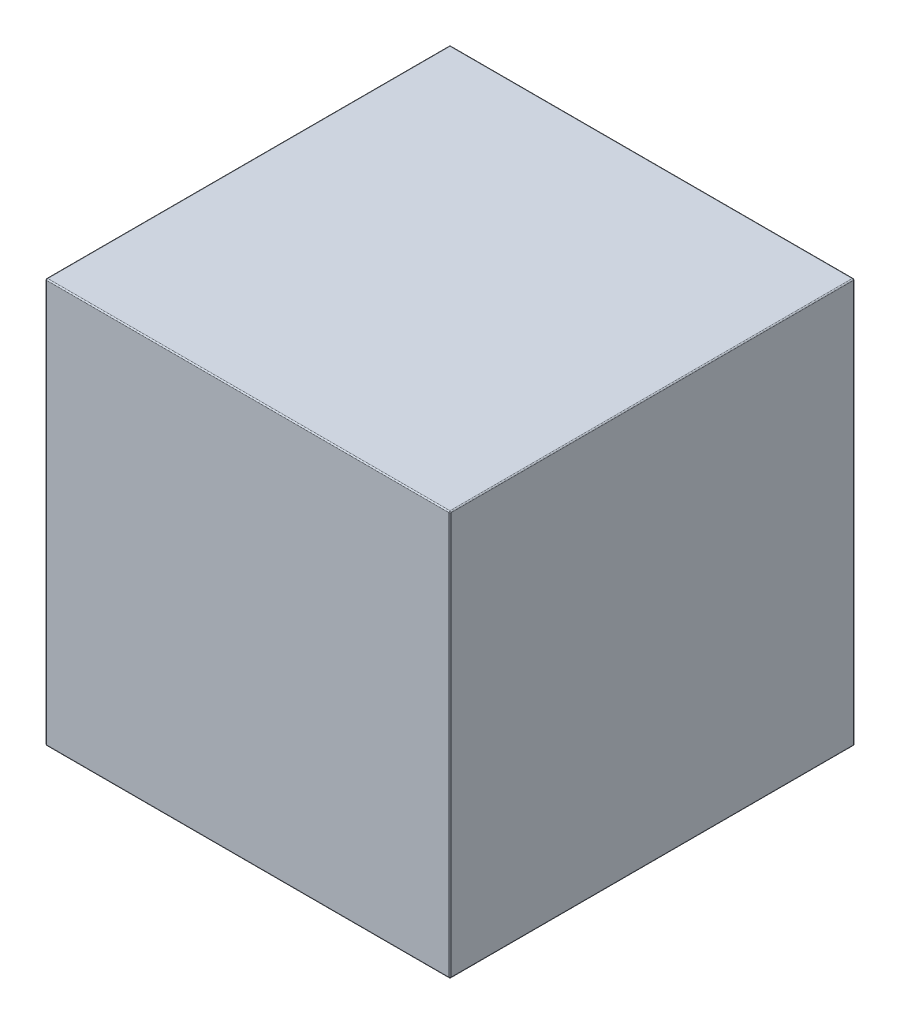
ISO-10303-21;
HEADER;
FILE_DESCRIPTION(('STEP AP214'),'2;1');
FILE_NAME('part.step','',(''),(''),'','','');
FILE_SCHEMA(('AUTOMOTIVE_DESIGN { 1 0 10303 214 1 1 1 1 }'));
ENDSEC;
DATA;
#1=APPLICATION_CONTEXT('core data for automotive mechanical design processes');
#2=APPLICATION_PROTOCOL_DEFINITION('international standard','automotive_design',2000,#1);
#3=PRODUCT_CONTEXT('',#1,'mechanical');
#4=PRODUCT('Part','Part','',(#3));
#5=PRODUCT_RELATED_PRODUCT_CATEGORY('part','',(#4));
#6=PRODUCT_DEFINITION_FORMATION('','',#4);
#7=PRODUCT_DEFINITION_CONTEXT('part definition',#1,'design');
#8=PRODUCT_DEFINITION('design','',#6,#7);
#9=PRODUCT_DEFINITION_SHAPE('','',#8);
#10=(LENGTH_UNIT() NAMED_UNIT(*) SI_UNIT(.MILLI.,.METRE.));
#11=(NAMED_UNIT(*) PLANE_ANGLE_UNIT() SI_UNIT($,.RADIAN.));
#12=(NAMED_UNIT(*) SI_UNIT($,.STERADIAN.) SOLID_ANGLE_UNIT());
#13=UNCERTAINTY_MEASURE_WITH_UNIT(LENGTH_MEASURE(1.E-05),#10,'distance_accuracy_value','');
#14=(GEOMETRIC_REPRESENTATION_CONTEXT(3) GLOBAL_UNCERTAINTY_ASSIGNED_CONTEXT((#13)) GLOBAL_UNIT_ASSIGNED_CONTEXT((#10,
#11,#12)) REPRESENTATION_CONTEXT('',''));
#15=CARTESIAN_POINT('',(0.,0.,0.));
#16=DIRECTION('',(0.,0.,1.));
#17=DIRECTION('',(1.,0.,0.));
#18=AXIS2_PLACEMENT_3D('',#15,#16,#17);
#19=CARTESIAN_POINT('',(175.,175.,-175.));
#20=DIRECTION('',(-1.,0.,0.));
#21=DIRECTION('',(0.,0.,1.));
#22=AXIS2_PLACEMENT_3D('',#19,#20,#21);
#23=PLANE('',#22);
#24=DIRECTION('',(0.,0.,-1.));
#25=VECTOR('',#24,1.);
#26=CARTESIAN_POINT('',(175.,-174.,-175.));
#27=LINE('',#26,#25);
#28=CARTESIAN_POINT('',(175.,-174.,174.));
#29=VERTEX_POINT('',#28);
#30=CARTESIAN_POINT('',(175.,-174.,-174.));
#31=VERTEX_POINT('',#30);
#32=EDGE_CURVE('E156',#29,#31,#27,.T.);
#33=ORIENTED_EDGE('',*,*,#32,.T.);
#34=DIRECTION('',(0.,-1.,0.));
#35=VECTOR('',#34,1.);
#36=CARTESIAN_POINT('',(175.,175.,-174.));
#37=LINE('',#36,#35);
#38=CARTESIAN_POINT('',(175.,174.,-174.));
#39=VERTEX_POINT('',#38);
#40=EDGE_CURVE('E134',#31,#39,#37,.F.);
#41=ORIENTED_EDGE('',*,*,#40,.T.);
#42=DIRECTION('',(0.,0.,-1.));
#43=VECTOR('',#42,1.);
#44=CARTESIAN_POINT('',(175.,174.,175.));
#45=LINE('',#44,#43);
#46=CARTESIAN_POINT('',(175.,174.,174.));
#47=VERTEX_POINT('',#46);
#48=EDGE_CURVE('E175',#39,#47,#45,.F.);
#49=ORIENTED_EDGE('',*,*,#48,.T.);
#50=DIRECTION('',(0.,-1.,0.));
#51=VECTOR('',#50,1.);
#52=CARTESIAN_POINT('',(175.,175.,174.));
#53=LINE('',#52,#51);
#54=EDGE_CURVE('E172',#47,#29,#53,.T.);
#55=ORIENTED_EDGE('',*,*,#54,.T.);
#56=EDGE_LOOP('',(#33,#41,#49,#55));
#57=FACE_BOUND('',#56,.T.);
#58=ADVANCED_FACE('F45',(#57),#23,.F.);
#59=CARTESIAN_POINT('',(-175.,175.,-175.));
#60=DIRECTION('',(0.,0.,1.));
#61=DIRECTION('',(1.,0.,0.));
#62=AXIS2_PLACEMENT_3D('',#59,#60,#61);
#63=PLANE('',#62);
#64=DIRECTION('',(-1.,0.,0.));
#65=VECTOR('',#64,1.);
#66=CARTESIAN_POINT('',(175.,174.,-175.));
#67=LINE('',#66,#65);
#68=CARTESIAN_POINT('',(-174.,174.,-175.));
#69=VERTEX_POINT('',#68);
#70=CARTESIAN_POINT('',(174.,174.,-175.));
#71=VERTEX_POINT('',#70);
#72=EDGE_CURVE('E153',#69,#71,#67,.F.);
#73=ORIENTED_EDGE('',*,*,#72,.T.);
#74=DIRECTION('',(0.,-1.,0.));
#75=VECTOR('',#74,1.);
#76=CARTESIAN_POINT('',(174.,175.,-175.));
#77=LINE('',#76,#75);
#78=CARTESIAN_POINT('',(174.,-175.,-175.));
#79=VERTEX_POINT('',#78);
#80=EDGE_CURVE('E132',#71,#79,#77,.T.);
#81=ORIENTED_EDGE('',*,*,#80,.T.);
#82=DIRECTION('',(-1.,0.,0.));
#83=VECTOR('',#82,1.);
#84=CARTESIAN_POINT('',(-175.,-175.,-175.));
#85=LINE('',#84,#83);
#86=CARTESIAN_POINT('',(-174.,-175.,-175.));
#87=VERTEX_POINT('',#86);
#88=EDGE_CURVE('E150',#79,#87,#85,.T.);
#89=ORIENTED_EDGE('',*,*,#88,.T.);
#90=DIRECTION('',(0.,-1.,0.));
#91=VECTOR('',#90,1.);
#92=CARTESIAN_POINT('',(-174.,175.,-175.));
#93=LINE('',#92,#91);
#94=EDGE_CURVE('E157',#87,#69,#93,.F.);
#95=ORIENTED_EDGE('',*,*,#94,.T.);
#96=EDGE_LOOP('',(#73,#81,#89,#95));
#97=FACE_BOUND('',#96,.T.);
#98=ADVANCED_FACE('F149',(#97),#63,.F.);
#99=CARTESIAN_POINT('',(-175.,175.,-175.));
#100=DIRECTION('',(1.,0.,0.));
#101=DIRECTION('',(0.,0.,-1.));
#102=AXIS2_PLACEMENT_3D('',#99,#100,#101);
#103=PLANE('',#102);
#104=DIRECTION('',(0.,0.,1.));
#105=VECTOR('',#104,1.);
#106=CARTESIAN_POINT('',(-175.,174.,-175.));
#107=LINE('',#106,#105);
#108=CARTESIAN_POINT('',(-175.,174.,174.));
#109=VERTEX_POINT('',#108);
#110=CARTESIAN_POINT('',(-175.,174.,-174.));
#111=VERTEX_POINT('',#110);
#112=EDGE_CURVE('E186',#109,#111,#107,.F.);
#113=ORIENTED_EDGE('',*,*,#112,.T.);
#114=DIRECTION('',(0.,-1.,0.));
#115=VECTOR('',#114,1.);
#116=CARTESIAN_POINT('',(-175.,175.,-174.));
#117=LINE('',#116,#115);
#118=CARTESIAN_POINT('',(-175.,-174.,-174.));
#119=VERTEX_POINT('',#118);
#120=EDGE_CURVE('E189',#111,#119,#117,.T.);
#121=ORIENTED_EDGE('',*,*,#120,.T.);
#122=DIRECTION('',(0.,0.,1.));
#123=VECTOR('',#122,1.);
#124=CARTESIAN_POINT('',(-175.,-174.,-175.));
#125=LINE('',#124,#123);
#126=CARTESIAN_POINT('',(-175.,-174.,174.));
#127=VERTEX_POINT('',#126);
#128=EDGE_CURVE('E180',#119,#127,#125,.T.);
#129=ORIENTED_EDGE('',*,*,#128,.T.);
#130=DIRECTION('',(0.,-1.,0.));
#131=VECTOR('',#130,1.);
#132=CARTESIAN_POINT('',(-175.,175.,174.));
#133=LINE('',#132,#131);
#134=EDGE_CURVE('E183',#127,#109,#133,.F.);
#135=ORIENTED_EDGE('',*,*,#134,.T.);
#136=EDGE_LOOP('',(#113,#121,#129,#135));
#137=FACE_BOUND('',#136,.T.);
#138=ADVANCED_FACE('F360',(#137),#103,.F.);
#139=CARTESIAN_POINT('',(-175.,175.,175.));
#140=DIRECTION('',(0.,0.,-1.));
#141=DIRECTION('',(-1.,0.,0.));
#142=AXIS2_PLACEMENT_3D('',#139,#140,#141);
#143=PLANE('',#142);
#144=DIRECTION('',(0.,-1.,0.));
#145=VECTOR('',#144,1.);
#146=CARTESIAN_POINT('',(174.,175.,175.));
#147=LINE('',#146,#145);
#148=CARTESIAN_POINT('',(174.,-174.,175.));
#149=VERTEX_POINT('',#148);
#150=CARTESIAN_POINT('',(174.,174.,175.));
#151=VERTEX_POINT('',#150);
#152=EDGE_CURVE('E209',#149,#151,#147,.F.);
#153=ORIENTED_EDGE('',*,*,#152,.T.);
#154=DIRECTION('',(1.,0.,0.));
#155=VECTOR('',#154,1.);
#156=CARTESIAN_POINT('',(-175.,174.,175.));
#157=LINE('',#156,#155);
#158=CARTESIAN_POINT('',(-174.,174.,175.));
#159=VERTEX_POINT('',#158);
#160=EDGE_CURVE('E145',#151,#159,#157,.F.);
#161=ORIENTED_EDGE('',*,*,#160,.T.);
#162=DIRECTION('',(0.,-1.,0.));
#163=VECTOR('',#162,1.);
#164=CARTESIAN_POINT('',(-174.,175.,175.));
#165=LINE('',#164,#163);
#166=CARTESIAN_POINT('',(-174.,-174.,175.));
#167=VERTEX_POINT('',#166);
#168=EDGE_CURVE('E212',#159,#167,#165,.T.);
#169=ORIENTED_EDGE('',*,*,#168,.T.);
#170=DIRECTION('',(1.,0.,0.));
#171=VECTOR('',#170,1.);
#172=CARTESIAN_POINT('',(-175.,-174.,175.));
#173=LINE('',#172,#171);
#174=EDGE_CURVE('E206',#167,#149,#173,.T.);
#175=ORIENTED_EDGE('',*,*,#174,.T.);
#176=EDGE_LOOP('',(#153,#161,#169,#175));
#177=FACE_BOUND('',#176,.T.);
#178=ADVANCED_FACE('F294',(#177),#143,.F.);
#179=CARTESIAN_POINT('',(0.,175.,0.));
#180=DIRECTION('',(0.,1.,0.));
#181=DIRECTION('',(0.,0.,1.));
#182=AXIS2_PLACEMENT_3D('',#179,#180,#181);
#183=PLANE('',#182);
#184=DIRECTION('',(0.,0.,1.));
#185=VECTOR('',#184,1.);
#186=CARTESIAN_POINT('',(-174.,175.,175.));
#187=LINE('',#186,#185);
#188=CARTESIAN_POINT('',(-174.,175.,-174.));
#189=VERTEX_POINT('',#188);
#190=CARTESIAN_POINT('',(-174.,175.,174.));
#191=VERTEX_POINT('',#190);
#192=EDGE_CURVE('E199',#189,#191,#187,.T.);
#193=ORIENTED_EDGE('',*,*,#192,.T.);
#194=DIRECTION('',(1.,0.,0.));
#195=VECTOR('',#194,1.);
#196=CARTESIAN_POINT('',(175.,175.,174.));
#197=LINE('',#196,#195);
#198=CARTESIAN_POINT('',(174.,175.,174.));
#199=VERTEX_POINT('',#198);
#200=EDGE_CURVE('E202',#191,#199,#197,.T.);
#201=ORIENTED_EDGE('',*,*,#200,.T.);
#202=DIRECTION('',(0.,0.,-1.));
#203=VECTOR('',#202,1.);
#204=CARTESIAN_POINT('',(174.,175.,-175.));
#205=LINE('',#204,#203);
#206=CARTESIAN_POINT('',(174.,175.,-174.));
#207=VERTEX_POINT('',#206);
#208=EDGE_CURVE('E193',#199,#207,#205,.T.);
#209=ORIENTED_EDGE('',*,*,#208,.T.);
#210=DIRECTION('',(-1.,0.,0.));
#211=VECTOR('',#210,1.);
#212=CARTESIAN_POINT('',(-175.,175.,-174.));
#213=LINE('',#212,#211);
#214=EDGE_CURVE('E196',#207,#189,#213,.T.);
#215=ORIENTED_EDGE('',*,*,#214,.T.);
#216=EDGE_LOOP('',(#193,#201,#209,#215));
#217=FACE_BOUND('',#216,.T.);
#218=ADVANCED_FACE('F317',(#217),#183,.T.);
#219=CARTESIAN_POINT('',(0.,-175.,0.));
#220=DIRECTION('',(0.,1.,0.));
#221=DIRECTION('',(0.,0.,1.));
#222=AXIS2_PLACEMENT_3D('',#219,#220,#221);
#223=PLANE('',#222);
#224=DIRECTION('',(1.,0.,0.));
#225=VECTOR('',#224,1.);
#226=CARTESIAN_POINT('',(0.,-175.,174.));
#227=LINE('',#226,#225);
#228=CARTESIAN_POINT('',(174.,-175.,174.));
#229=VERTEX_POINT('',#228);
#230=CARTESIAN_POINT('',(-174.,-175.,174.));
#231=VERTEX_POINT('',#230);
#232=EDGE_CURVE('E55',#229,#231,#227,.F.);
#233=ORIENTED_EDGE('',*,*,#232,.T.);
#234=DIRECTION('',(0.,0.,1.));
#235=VECTOR('',#234,1.);
#236=CARTESIAN_POINT('',(-174.,-175.,0.));
#237=LINE('',#236,#235);
#238=EDGE_CURVE('E11',#231,#87,#237,.F.);
#239=ORIENTED_EDGE('',*,*,#238,.T.);
#240=ORIENTED_EDGE('',*,*,#88,.F.);
#241=DIRECTION('',(0.,0.,-1.));
#242=VECTOR('',#241,1.);
#243=CARTESIAN_POINT('',(174.,-175.,0.));
#244=LINE('',#243,#242);
#245=EDGE_CURVE('E66',#79,#229,#244,.F.);
#246=ORIENTED_EDGE('',*,*,#245,.T.);
#247=EDGE_LOOP('',(#233,#239,#240,#246));
#248=FACE_BOUND('',#247,.T.);
#249=ADVANCED_FACE('F159',(#248),#223,.F.);
#250=CARTESIAN_POINT('',(-174.,174.,174.));
#251=DIRECTION('',(0.,0.,1.));
#252=DIRECTION('',(1.,0.,0.));
#253=AXIS2_PLACEMENT_3D('',#250,#251,#252);
#254=SPHERICAL_SURFACE('',#253,1.);
#255=CARTESIAN_POINT('',(-174.,174.,174.));
#256=DIRECTION('',(0.,0.,1.));
#257=DIRECTION('',(1.,0.,0.));
#258=AXIS2_PLACEMENT_3D('',#255,#256,#257);
#259=CIRCLE('',#258,1.);
#260=EDGE_CURVE('E279',#109,#191,#259,.F.);
#261=ORIENTED_EDGE('',*,*,#260,.F.);
#262=CARTESIAN_POINT('',(-174.,174.,174.));
#263=DIRECTION('',(0.,1.,0.));
#264=DIRECTION('',(0.,0.,1.));
#265=AXIS2_PLACEMENT_3D('',#262,#263,#264);
#266=CIRCLE('',#265,1.);
#267=EDGE_CURVE('E49',#159,#109,#266,.F.);
#268=ORIENTED_EDGE('',*,*,#267,.F.);
#269=CARTESIAN_POINT('',(-174.,174.,174.));
#270=DIRECTION('',(-1.,0.,0.));
#271=DIRECTION('',(0.,0.,1.));
#272=AXIS2_PLACEMENT_3D('',#269,#270,#271);
#273=CIRCLE('',#272,1.);
#274=EDGE_CURVE('E166',#191,#159,#273,.F.);
#275=ORIENTED_EDGE('',*,*,#274,.F.);
#276=EDGE_LOOP('',(#261,#268,#275));
#277=FACE_BOUND('',#276,.T.);
#278=ADVANCED_FACE('F47',(#277),#254,.T.);
#279=CARTESIAN_POINT('',(-174.,-174.,-175.));
#280=DIRECTION('',(0.,0.,1.));
#281=DIRECTION('',(1.,0.,0.));
#282=AXIS2_PLACEMENT_3D('',#279,#280,#281);
#283=CYLINDRICAL_SURFACE('',#282,1.);
#284=CARTESIAN_POINT('',(-174.,-174.,174.));
#285=DIRECTION('',(0.,0.,1.));
#286=DIRECTION('',(1.,0.,0.));
#287=AXIS2_PLACEMENT_3D('',#284,#285,#286);
#288=CIRCLE('',#287,1.);
#289=EDGE_CURVE('E272',#127,#231,#288,.T.);
#290=ORIENTED_EDGE('',*,*,#289,.F.);
#291=ORIENTED_EDGE('',*,*,#128,.F.);
#292=CARTESIAN_POINT('',(-174.,-174.,-174.));
#293=DIRECTION('',(0.,-0.707106781186547,0.707106781186547));
#294=DIRECTION('',(0.,0.707106781186547,0.707106781186547));
#295=AXIS2_PLACEMENT_3D('',#292,#293,#294);
#296=ELLIPSE('',#295,1.41421356237309,1.);
#297=EDGE_CURVE('E276',#87,#119,#296,.F.);
#298=ORIENTED_EDGE('',*,*,#297,.F.);
#299=ORIENTED_EDGE('',*,*,#238,.F.);
#300=EDGE_LOOP('',(#290,#291,#298,#299));
#301=FACE_BOUND('',#300,.T.);
#302=ADVANCED_FACE('F333',(#301),#283,.T.);
#303=CARTESIAN_POINT('',(-174.,175.,174.));
#304=DIRECTION('',(0.,-1.,0.));
#305=DIRECTION('',(0.,0.,-1.));
#306=AXIS2_PLACEMENT_3D('',#303,#304,#305);
#307=CYLINDRICAL_SURFACE('',#306,1.);
#308=ORIENTED_EDGE('',*,*,#267,.T.);
#309=ORIENTED_EDGE('',*,*,#134,.F.);
#310=CARTESIAN_POINT('',(-174.,-174.,174.));
#311=DIRECTION('',(0.,-1.,0.));
#312=DIRECTION('',(0.,0.,-1.));
#313=AXIS2_PLACEMENT_3D('',#310,#311,#312);
#314=CIRCLE('',#313,1.);
#315=EDGE_CURVE('E268',#167,#127,#314,.T.);
#316=ORIENTED_EDGE('',*,*,#315,.F.);
#317=ORIENTED_EDGE('',*,*,#168,.F.);
#318=EDGE_LOOP('',(#308,#309,#316,#317));
#319=FACE_BOUND('',#318,.T.);
#320=ADVANCED_FACE('F326',(#319),#307,.T.);
#321=CARTESIAN_POINT('',(0.,174.,174.));
#322=DIRECTION('',(-1.,0.,0.));
#323=DIRECTION('',(0.,0.,1.));
#324=AXIS2_PLACEMENT_3D('',#321,#322,#323);
#325=CYLINDRICAL_SURFACE('',#324,1.);
#326=ORIENTED_EDGE('',*,*,#274,.T.);
#327=ORIENTED_EDGE('',*,*,#160,.F.);
#328=CARTESIAN_POINT('',(174.,174.,174.));
#329=DIRECTION('',(1.,0.,0.));
#330=DIRECTION('',(0.,0.,-1.));
#331=AXIS2_PLACEMENT_3D('',#328,#329,#330);
#332=CIRCLE('',#331,1.);
#333=EDGE_CURVE('E264',#199,#151,#332,.T.);
#334=ORIENTED_EDGE('',*,*,#333,.F.);
#335=ORIENTED_EDGE('',*,*,#200,.F.);
#336=EDGE_LOOP('',(#326,#327,#334,#335));
#337=FACE_BOUND('',#336,.T.);
#338=ADVANCED_FACE('F288',(#337),#325,.T.);
#339=CARTESIAN_POINT('',(-174.,174.,0.));
#340=DIRECTION('',(0.,0.,-1.));
#341=DIRECTION('',(-1.,0.,0.));
#342=AXIS2_PLACEMENT_3D('',#339,#340,#341);
#343=CYLINDRICAL_SURFACE('',#342,1.);
#344=ORIENTED_EDGE('',*,*,#260,.T.);
#345=ORIENTED_EDGE('',*,*,#192,.F.);
#346=CARTESIAN_POINT('',(-174.,174.,-174.));
#347=DIRECTION('',(0.,0.,-1.));
#348=DIRECTION('',(-1.,0.,0.));
#349=AXIS2_PLACEMENT_3D('',#346,#347,#348);
#350=CIRCLE('',#349,1.);
#351=EDGE_CURVE('E260',#111,#189,#350,.T.);
#352=ORIENTED_EDGE('',*,*,#351,.F.);
#353=ORIENTED_EDGE('',*,*,#112,.F.);
#354=EDGE_LOOP('',(#344,#345,#352,#353));
#355=FACE_BOUND('',#354,.T.);
#356=ADVANCED_FACE('F323',(#355),#343,.T.);
#357=CARTESIAN_POINT('',(-174.,175.,-174.));
#358=DIRECTION('',(0.,-1.,0.));
#359=DIRECTION('',(0.,0.,-1.));
#360=AXIS2_PLACEMENT_3D('',#357,#358,#359);
#361=CYLINDRICAL_SURFACE('',#360,1.);
#362=ORIENTED_EDGE('',*,*,#297,.T.);
#363=ORIENTED_EDGE('',*,*,#120,.F.);
#364=CARTESIAN_POINT('',(-174.,174.,-174.));
#365=DIRECTION('',(0.,1.,0.));
#366=DIRECTION('',(0.,0.,1.));
#367=AXIS2_PLACEMENT_3D('',#364,#365,#366);
#368=CIRCLE('',#367,1.);
#369=EDGE_CURVE('E256',#69,#111,#368,.T.);
#370=ORIENTED_EDGE('',*,*,#369,.F.);
#371=ORIENTED_EDGE('',*,*,#94,.F.);
#372=EDGE_LOOP('',(#362,#363,#370,#371));
#373=FACE_BOUND('',#372,.T.);
#374=ADVANCED_FACE('F338',(#373),#361,.T.);
#375=CARTESIAN_POINT('',(-174.,-174.,174.));
#376=DIRECTION('',(-1.,0.,0.));
#377=DIRECTION('',(0.,0.,1.));
#378=AXIS2_PLACEMENT_3D('',#375,#376,#377);
#379=SPHERICAL_SURFACE('',#378,1.);
#380=ORIENTED_EDGE('',*,*,#315,.T.);
#381=ORIENTED_EDGE('',*,*,#289,.T.);
#382=CARTESIAN_POINT('',(-174.,-174.,174.));
#383=DIRECTION('',(-1.,0.,0.));
#384=DIRECTION('',(0.,0.,1.));
#385=AXIS2_PLACEMENT_3D('',#382,#383,#384);
#386=CIRCLE('',#385,1.);
#387=EDGE_CURVE('E252',#167,#231,#386,.F.);
#388=ORIENTED_EDGE('',*,*,#387,.F.);
#389=EDGE_LOOP('',(#380,#381,#388));
#390=FACE_BOUND('',#389,.T.);
#391=ADVANCED_FACE('F330',(#390),#379,.T.);
#392=CARTESIAN_POINT('',(174.,174.,174.));
#393=DIRECTION('',(0.,0.,1.));
#394=DIRECTION('',(1.,0.,0.));
#395=AXIS2_PLACEMENT_3D('',#392,#393,#394);
#396=SPHERICAL_SURFACE('',#395,1.);
#397=CARTESIAN_POINT('',(174.,174.,174.));
#398=DIRECTION('',(0.,0.,1.));
#399=DIRECTION('',(1.,0.,0.));
#400=AXIS2_PLACEMENT_3D('',#397,#398,#399);
#401=CIRCLE('',#400,1.);
#402=EDGE_CURVE('E244',#199,#47,#401,.F.);
#403=ORIENTED_EDGE('',*,*,#402,.F.);
#404=ORIENTED_EDGE('',*,*,#333,.T.);
#405=CARTESIAN_POINT('',(174.,174.,174.));
#406=DIRECTION('',(0.,1.,0.));
#407=DIRECTION('',(0.,0.,1.));
#408=AXIS2_PLACEMENT_3D('',#405,#406,#407);
#409=CIRCLE('',#408,1.);
#410=EDGE_CURVE('E248',#47,#151,#409,.F.);
#411=ORIENTED_EDGE('',*,*,#410,.F.);
#412=EDGE_LOOP('',(#403,#404,#411));
#413=FACE_BOUND('',#412,.T.);
#414=ADVANCED_FACE('F315',(#413),#396,.T.);
#415=CARTESIAN_POINT('',(-174.,174.,-174.));
#416=DIRECTION('',(-1.,0.,0.));
#417=DIRECTION('',(0.,0.,1.));
#418=AXIS2_PLACEMENT_3D('',#415,#416,#417);
#419=SPHERICAL_SURFACE('',#418,1.);
#420=ORIENTED_EDGE('',*,*,#369,.T.);
#421=ORIENTED_EDGE('',*,*,#351,.T.);
#422=CARTESIAN_POINT('',(-174.,174.,-174.));
#423=DIRECTION('',(-1.,0.,0.));
#424=DIRECTION('',(0.,0.,1.));
#425=AXIS2_PLACEMENT_3D('',#422,#423,#424);
#426=CIRCLE('',#425,1.);
#427=EDGE_CURVE('E240',#69,#189,#426,.F.);
#428=ORIENTED_EDGE('',*,*,#427,.F.);
#429=EDGE_LOOP('',(#420,#421,#428));
#430=FACE_BOUND('',#429,.T.);
#431=ADVANCED_FACE('F341',(#430),#419,.T.);
#432=CARTESIAN_POINT('',(-175.,-174.,174.));
#433=DIRECTION('',(1.,0.,0.));
#434=DIRECTION('',(0.,0.,-1.));
#435=AXIS2_PLACEMENT_3D('',#432,#433,#434);
#436=CYLINDRICAL_SURFACE('',#435,1.);
#437=ORIENTED_EDGE('',*,*,#387,.T.);
#438=ORIENTED_EDGE('',*,*,#232,.F.);
#439=CARTESIAN_POINT('',(174.,-174.,174.));
#440=DIRECTION('',(1.,0.,0.));
#441=DIRECTION('',(0.,0.,-1.));
#442=AXIS2_PLACEMENT_3D('',#439,#440,#441);
#443=CIRCLE('',#442,1.);
#444=EDGE_CURVE('E236',#149,#229,#443,.T.);
#445=ORIENTED_EDGE('',*,*,#444,.F.);
#446=ORIENTED_EDGE('',*,*,#174,.F.);
#447=EDGE_LOOP('',(#437,#438,#445,#446));
#448=FACE_BOUND('',#447,.T.);
#449=ADVANCED_FACE('F305',(#448),#436,.T.);
#450=CARTESIAN_POINT('',(174.,175.,174.));
#451=DIRECTION('',(0.,-1.,0.));
#452=DIRECTION('',(0.,0.,-1.));
#453=AXIS2_PLACEMENT_3D('',#450,#451,#452);
#454=CYLINDRICAL_SURFACE('',#453,1.);
#455=ORIENTED_EDGE('',*,*,#410,.T.);
#456=ORIENTED_EDGE('',*,*,#152,.F.);
#457=CARTESIAN_POINT('',(174.,-174.,174.));
#458=DIRECTION('',(0.,-1.,0.));
#459=DIRECTION('',(0.,0.,-1.));
#460=AXIS2_PLACEMENT_3D('',#457,#458,#459);
#461=CIRCLE('',#460,1.);
#462=EDGE_CURVE('E232',#29,#149,#461,.T.);
#463=ORIENTED_EDGE('',*,*,#462,.F.);
#464=ORIENTED_EDGE('',*,*,#54,.F.);
#465=EDGE_LOOP('',(#455,#456,#463,#464));
#466=FACE_BOUND('',#465,.T.);
#467=ADVANCED_FACE('F301',(#466),#454,.T.);
#468=CARTESIAN_POINT('',(174.,174.,0.));
#469=DIRECTION('',(0.,0.,1.));
#470=DIRECTION('',(1.,0.,0.));
#471=AXIS2_PLACEMENT_3D('',#468,#469,#470);
#472=CYLINDRICAL_SURFACE('',#471,1.);
#473=ORIENTED_EDGE('',*,*,#402,.T.);
#474=ORIENTED_EDGE('',*,*,#48,.F.);
#475=CARTESIAN_POINT('',(174.,174.,-174.));
#476=DIRECTION('',(0.,0.,-1.));
#477=DIRECTION('',(-1.,0.,0.));
#478=AXIS2_PLACEMENT_3D('',#475,#476,#477);
#479=CIRCLE('',#478,1.);
#480=EDGE_CURVE('E228',#207,#39,#479,.T.);
#481=ORIENTED_EDGE('',*,*,#480,.F.);
#482=ORIENTED_EDGE('',*,*,#208,.F.);
#483=EDGE_LOOP('',(#473,#474,#481,#482));
#484=FACE_BOUND('',#483,.T.);
#485=ADVANCED_FACE('F313',(#484),#472,.T.);
#486=CARTESIAN_POINT('',(0.,174.,-174.));
#487=DIRECTION('',(1.,0.,0.));
#488=DIRECTION('',(0.,0.,-1.));
#489=AXIS2_PLACEMENT_3D('',#486,#487,#488);
#490=CYLINDRICAL_SURFACE('',#489,1.);
#491=ORIENTED_EDGE('',*,*,#427,.T.);
#492=ORIENTED_EDGE('',*,*,#214,.F.);
#493=CARTESIAN_POINT('',(174.,174.,-174.));
#494=DIRECTION('',(1.,0.,0.));
#495=DIRECTION('',(0.,0.,-1.));
#496=AXIS2_PLACEMENT_3D('',#493,#494,#495);
#497=CIRCLE('',#496,1.);
#498=EDGE_CURVE('E224',#71,#207,#497,.T.);
#499=ORIENTED_EDGE('',*,*,#498,.F.);
#500=ORIENTED_EDGE('',*,*,#72,.F.);
#501=EDGE_LOOP('',(#491,#492,#499,#500));
#502=FACE_BOUND('',#501,.T.);
#503=ADVANCED_FACE('F343',(#502),#490,.T.);
#504=CARTESIAN_POINT('',(174.,-174.,174.));
#505=DIRECTION('',(0.,0.,1.));
#506=DIRECTION('',(1.,0.,0.));
#507=AXIS2_PLACEMENT_3D('',#504,#505,#506);
#508=SPHERICAL_SURFACE('',#507,1.);
#509=ORIENTED_EDGE('',*,*,#462,.T.);
#510=ORIENTED_EDGE('',*,*,#444,.T.);
#511=CARTESIAN_POINT('',(174.,-174.,174.));
#512=DIRECTION('',(0.,0.,1.));
#513=DIRECTION('',(1.,0.,0.));
#514=AXIS2_PLACEMENT_3D('',#511,#512,#513);
#515=CIRCLE('',#514,1.);
#516=EDGE_CURVE('E143',#29,#229,#515,.F.);
#517=ORIENTED_EDGE('',*,*,#516,.F.);
#518=EDGE_LOOP('',(#509,#510,#517));
#519=FACE_BOUND('',#518,.T.);
#520=ADVANCED_FACE('F307',(#519),#508,.T.);
#521=CARTESIAN_POINT('',(174.,174.,-174.));
#522=DIRECTION('',(0.,1.,0.));
#523=DIRECTION('',(0.,0.,1.));
#524=AXIS2_PLACEMENT_3D('',#521,#522,#523);
#525=SPHERICAL_SURFACE('',#524,1.);
#526=ORIENTED_EDGE('',*,*,#498,.T.);
#527=ORIENTED_EDGE('',*,*,#480,.T.);
#528=CARTESIAN_POINT('',(174.,174.,-174.));
#529=DIRECTION('',(0.,1.,0.));
#530=DIRECTION('',(0.,0.,1.));
#531=AXIS2_PLACEMENT_3D('',#528,#529,#530);
#532=CIRCLE('',#531,1.);
#533=EDGE_CURVE('E138',#71,#39,#532,.F.);
#534=ORIENTED_EDGE('',*,*,#533,.F.);
#535=EDGE_LOOP('',(#526,#527,#534));
#536=FACE_BOUND('',#535,.T.);
#537=ADVANCED_FACE('F346',(#536),#525,.T.);
#538=CARTESIAN_POINT('',(174.,-174.,-175.));
#539=DIRECTION('',(0.,0.,-1.));
#540=DIRECTION('',(-1.,0.,0.));
#541=AXIS2_PLACEMENT_3D('',#538,#539,#540);
#542=CYLINDRICAL_SURFACE('',#541,1.);
#543=ORIENTED_EDGE('',*,*,#516,.T.);
#544=ORIENTED_EDGE('',*,*,#245,.F.);
#545=CARTESIAN_POINT('',(174.,-174.,-174.));
#546=DIRECTION('',(0.,0.707106781186547,-0.707106781186547));
#547=DIRECTION('',(0.,-0.707106781186547,-0.707106781186547));
#548=AXIS2_PLACEMENT_3D('',#545,#546,#547);
#549=ELLIPSE('',#548,1.41421356237309,1.);
#550=EDGE_CURVE('E129',#31,#79,#549,.T.);
#551=ORIENTED_EDGE('',*,*,#550,.F.);
#552=ORIENTED_EDGE('',*,*,#32,.F.);
#553=EDGE_LOOP('',(#543,#544,#551,#552));
#554=FACE_BOUND('',#553,.T.);
#555=ADVANCED_FACE('F141',(#554),#542,.T.);
#556=CARTESIAN_POINT('',(174.,175.,-174.));
#557=DIRECTION('',(0.,-1.,0.));
#558=DIRECTION('',(0.,0.,-1.));
#559=AXIS2_PLACEMENT_3D('',#556,#557,#558);
#560=CYLINDRICAL_SURFACE('',#559,1.);
#561=ORIENTED_EDGE('',*,*,#533,.T.);
#562=ORIENTED_EDGE('',*,*,#40,.F.);
#563=ORIENTED_EDGE('',*,*,#550,.T.);
#564=ORIENTED_EDGE('',*,*,#80,.F.);
#565=EDGE_LOOP('',(#561,#562,#563,#564));
#566=FACE_BOUND('',#565,.T.);
#567=ADVANCED_FACE('F130',(#566),#560,.T.);
#568=CLOSED_SHELL('',(#58,#98,#138,#178,#218,#249,#278,#302,#320,#338,#356,#374,#391,#414,#431,
#449,#467,#485,#503,#520,#537,#555,#567));
#569=MANIFOLD_SOLID_BREP('B2',#568);
#570=ADVANCED_BREP_SHAPE_REPRESENTATION('',(#18,#569),#14);
#571=SHAPE_DEFINITION_REPRESENTATION(#9,#570);
ENDSEC;
END-ISO-10303-21;
